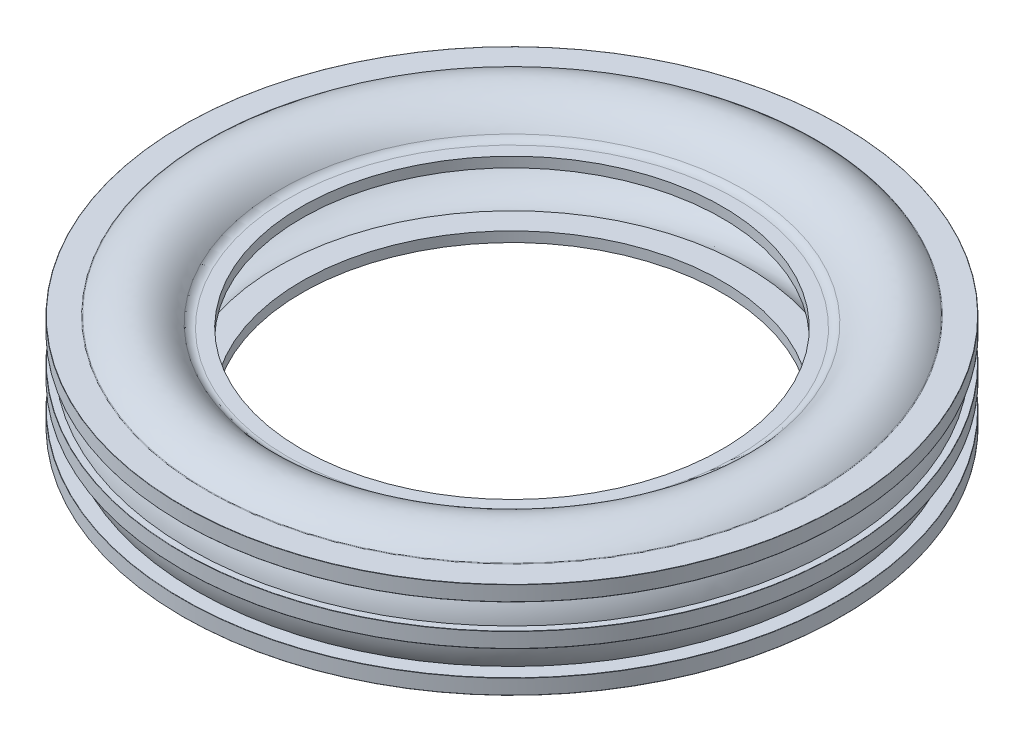
ISO-10303-21;
HEADER;
FILE_DESCRIPTION(('STEP AP214'),'2;1');
FILE_NAME('part.step','',(''),(''),'','','');
FILE_SCHEMA(('AUTOMOTIVE_DESIGN { 1 0 10303 214 1 1 1 1 }'));
ENDSEC;
DATA;
#1=APPLICATION_CONTEXT('core data for automotive mechanical design processes');
#2=APPLICATION_PROTOCOL_DEFINITION('international standard','automotive_design',2000,#1);
#3=PRODUCT_CONTEXT('',#1,'mechanical');
#4=PRODUCT('Part','Part','',(#3));
#5=PRODUCT_RELATED_PRODUCT_CATEGORY('part','',(#4));
#6=PRODUCT_DEFINITION_FORMATION('','',#4);
#7=PRODUCT_DEFINITION_CONTEXT('part definition',#1,'design');
#8=PRODUCT_DEFINITION('design','',#6,#7);
#9=PRODUCT_DEFINITION_SHAPE('','',#8);
#10=(LENGTH_UNIT() NAMED_UNIT(*) SI_UNIT(.MILLI.,.METRE.));
#11=(NAMED_UNIT(*) PLANE_ANGLE_UNIT() SI_UNIT($,.RADIAN.));
#12=(NAMED_UNIT(*) SI_UNIT($,.STERADIAN.) SOLID_ANGLE_UNIT());
#13=UNCERTAINTY_MEASURE_WITH_UNIT(LENGTH_MEASURE(1.E-05),#10,'distance_accuracy_value','');
#14=(GEOMETRIC_REPRESENTATION_CONTEXT(3) GLOBAL_UNCERTAINTY_ASSIGNED_CONTEXT((#13)) GLOBAL_UNIT_ASSIGNED_CONTEXT((#10,
#11,#12)) REPRESENTATION_CONTEXT('',''));
#15=CARTESIAN_POINT('',(0.,0.,0.));
#16=DIRECTION('',(0.,0.,1.));
#17=DIRECTION('',(1.,0.,0.));
#18=AXIS2_PLACEMENT_3D('',#15,#16,#17);
#19=CARTESIAN_POINT('',(-268.,0.,0.));
#20=DIRECTION('',(0.,0.,1.));
#21=DIRECTION('',(0.,1.,0.));
#22=AXIS2_PLACEMENT_3D('',#19,#20,#21);
#23=ELLIPSE('',#22,51.,42.);
#24=CARTESIAN_POINT('',(0.,0.,0.));
#25=DIRECTION('',(0.,1.,0.));
#26=AXIS1_PLACEMENT('',#24,#25);
#27=SURFACE_OF_REVOLUTION('',#23,#26);
#28=CARTESIAN_POINT('',(0.,-7.50000000000003,0.));
#29=DIRECTION('',(0.,1.,0.));
#30=DIRECTION('',(0.,0.,1.));
#31=AXIS2_PLACEMENT_3D('',#28,#29,#30);
#32=CIRCLE('',#31,309.543365427859);
#33=CARTESIAN_POINT('',(0.,-7.50000000000003,309.543365427859));
#34=VERTEX_POINT('',#33);
#35=EDGE_CURVE('E97',#34,#34,#32,.F.);
#36=ORIENTED_EDGE('',*,*,#35,.F.);
#37=EDGE_LOOP('',(#36));
#38=FACE_BOUND('',#37,.T.);
#39=CARTESIAN_POINT('',(0.,-32.5,0.));
#40=DIRECTION('',(0.,1.,0.));
#41=DIRECTION('',(0.,0.,1.));
#42=AXIS2_PLACEMENT_3D('',#39,#40,#41);
#43=CIRCLE('',#42,300.367429910809);
#44=CARTESIAN_POINT('',(0.,-32.5,300.367429910809));
#45=VERTEX_POINT('',#44);
#46=EDGE_CURVE('E91',#45,#45,#43,.T.);
#47=ORIENTED_EDGE('',*,*,#46,.F.);
#48=EDGE_LOOP('',(#47));
#49=FACE_BOUND('',#48,.T.);
#50=ADVANCED_FACE('F32',(#38,#49),#27,.T.);
#51=CARTESIAN_POINT('',(0.,0.,0.));
#52=DIRECTION('',(0.,1.,0.));
#53=AXIS1_PLACEMENT('',#51,#52);
#54=SURFACE_OF_REVOLUTION('',#23,#53);
#55=OFFSET_SURFACE('',#54,-10.,.F.);
#56=CARTESIAN_POINT('',(0.,-7.50000000000004,0.));
#57=DIRECTION('',(0.,1.,0.));
#58=DIRECTION('',(0.,0.,1.));
#59=AXIS2_PLACEMENT_3D('',#56,#57,#58);
#60=CIRCLE('',#59,319.60747870052);
#61=CARTESIAN_POINT('',(0.,-7.50000000000004,319.60747870052));
#62=VERTEX_POINT('',#61);
#63=EDGE_CURVE('E298',#62,#62,#60,.F.);
#64=ORIENTED_EDGE('',*,*,#63,.T.);
#65=EDGE_LOOP('',(#64));
#66=FACE_BOUND('',#65,.T.);
#67=CARTESIAN_POINT('',(0.,-32.5,0.));
#68=DIRECTION('',(0.,1.,0.));
#69=DIRECTION('',(0.,0.,1.));
#70=AXIS2_PLACEMENT_3D('',#67,#68,#69);
#71=CIRCLE('',#70,312.038326603439);
#72=CARTESIAN_POINT('',(0.,-32.5,312.038326603439));
#73=VERTEX_POINT('',#72);
#74=EDGE_CURVE('E92',#73,#73,#71,.T.);
#75=ORIENTED_EDGE('',*,*,#74,.T.);
#76=EDGE_LOOP('',(#75));
#77=FACE_BOUND('',#76,.T.);
#78=ADVANCED_FACE('F216',(#66,#77),#55,.F.);
#79=CARTESIAN_POINT('',(0.,32.5000000000001,0.));
#80=DIRECTION('',(0.,1.,0.));
#81=DIRECTION('',(0.,0.,1.));
#82=AXIS2_PLACEMENT_3D('',#79,#80,#81);
#83=CIRCLE('',#82,312.038326603439);
#84=CARTESIAN_POINT('',(0.,32.5000000000001,312.038326603439));
#85=VERTEX_POINT('',#84);
#86=EDGE_CURVE('E133',#85,#85,#83,.F.);
#87=ORIENTED_EDGE('',*,*,#86,.T.);
#88=EDGE_LOOP('',(#87));
#89=FACE_BOUND('',#88,.T.);
#90=CARTESIAN_POINT('',(0.,7.49999999999996,0.));
#91=DIRECTION('',(0.,1.,0.));
#92=DIRECTION('',(0.,0.,1.));
#93=AXIS2_PLACEMENT_3D('',#90,#91,#92);
#94=CIRCLE('',#93,319.60747870052);
#95=CARTESIAN_POINT('',(0.,7.49999999999996,319.60747870052));
#96=VERTEX_POINT('',#95);
#97=EDGE_CURVE('E301',#96,#96,#94,.T.);
#98=ORIENTED_EDGE('',*,*,#97,.T.);
#99=EDGE_LOOP('',(#98));
#100=FACE_BOUND('',#99,.T.);
#101=ADVANCED_FACE('F221',(#89,#100),#55,.F.);
#102=CARTESIAN_POINT('',(0.,32.5,0.));
#103=DIRECTION('',(0.,1.,0.));
#104=DIRECTION('',(0.,0.,1.));
#105=AXIS2_PLACEMENT_3D('',#102,#103,#104);
#106=CIRCLE('',#105,300.367429910809);
#107=CARTESIAN_POINT('',(0.,32.5,300.367429910809));
#108=VERTEX_POINT('',#107);
#109=EDGE_CURVE('E106',#108,#108,#106,.F.);
#110=ORIENTED_EDGE('',*,*,#109,.F.);
#111=EDGE_LOOP('',(#110));
#112=FACE_BOUND('',#111,.T.);
#113=CARTESIAN_POINT('',(0.,7.49999999999997,0.));
#114=DIRECTION('',(0.,1.,0.));
#115=DIRECTION('',(0.,0.,1.));
#116=AXIS2_PLACEMENT_3D('',#113,#114,#115);
#117=CIRCLE('',#116,309.543365427859);
#118=CARTESIAN_POINT('',(0.,7.49999999999997,309.543365427859));
#119=VERTEX_POINT('',#118);
#120=EDGE_CURVE('E100',#119,#119,#117,.T.);
#121=ORIENTED_EDGE('',*,*,#120,.F.);
#122=EDGE_LOOP('',(#121));
#123=FACE_BOUND('',#122,.T.);
#124=ADVANCED_FACE('F149',(#112,#123),#27,.T.);
#125=CARTESIAN_POINT('',(0.,32.5,300.));
#126=DIRECTION('',(0.,1.,0.));
#127=DIRECTION('',(0.,0.,1.));
#128=AXIS2_PLACEMENT_3D('',#125,#126,#127);
#129=PLANE('',#128);
#130=CARTESIAN_POINT('',(0.,32.5,0.));
#131=DIRECTION('',(0.,-1.,0.));
#132=DIRECTION('',(0.,0.,-1.));
#133=AXIS2_PLACEMENT_3D('',#130,#131,#132);
#134=CIRCLE('',#133,300.);
#135=CARTESIAN_POINT('',(0.,32.5,-300.));
#136=VERTEX_POINT('',#135);
#137=EDGE_CURVE('E295',#136,#136,#134,.T.);
#138=ORIENTED_EDGE('',*,*,#137,.F.);
#139=EDGE_LOOP('',(#138));
#140=FACE_BOUND('',#139,.T.);
#141=ORIENTED_EDGE('',*,*,#109,.T.);
#142=EDGE_LOOP('',(#141));
#143=FACE_BOUND('',#142,.T.);
#144=ADVANCED_FACE('F226',(#140,#143),#129,.F.);
#145=CARTESIAN_POINT('',(0.,0.,0.));
#146=DIRECTION('',(0.,-1.,0.));
#147=DIRECTION('',(0.,0.,-1.));
#148=AXIS2_PLACEMENT_3D('',#145,#146,#147);
#149=CYLINDRICAL_SURFACE('',#148,300.);
#150=ORIENTED_EDGE('',*,*,#137,.T.);
#151=EDGE_LOOP('',(#150));
#152=FACE_BOUND('',#151,.T.);
#153=CARTESIAN_POINT('',(0.,33.0321426640718,0.));
#154=DIRECTION('',(0.,1.,0.));
#155=DIRECTION('',(0.,0.,1.));
#156=AXIS2_PLACEMENT_3D('',#153,#154,#155);
#157=CIRCLE('',#156,300.);
#158=CARTESIAN_POINT('',(0.,33.0321426640718,300.));
#159=VERTEX_POINT('',#158);
#160=EDGE_CURVE('E103',#159,#159,#157,.T.);
#161=ORIENTED_EDGE('',*,*,#160,.T.);
#162=EDGE_LOOP('',(#161));
#163=FACE_BOUND('',#162,.T.);
#164=ADVANCED_FACE('F169',(#152,#163),#149,.F.);
#165=CARTESIAN_POINT('',(0.,27.,0.));
#166=DIRECTION('',(0.,1.,0.));
#167=DIRECTION('',(0.,0.,1.));
#168=AXIS2_PLACEMENT_3D('',#165,#166,#167);
#169=CYLINDRICAL_SURFACE('',#168,208.);
#170=CARTESIAN_POINT('',(0.,37.,0.));
#171=DIRECTION('',(0.,1.,0.));
#172=DIRECTION('',(0.,0.,1.));
#173=AXIS2_PLACEMENT_3D('',#170,#171,#172);
#174=CIRCLE('',#173,208.);
#175=CARTESIAN_POINT('',(0.,37.,208.));
#176=VERTEX_POINT('',#175);
#177=EDGE_CURVE('E121',#176,#176,#174,.T.);
#178=ORIENTED_EDGE('',*,*,#177,.T.);
#179=EDGE_LOOP('',(#178));
#180=FACE_BOUND('',#179,.T.);
#181=CARTESIAN_POINT('',(0.,27.,0.));
#182=DIRECTION('',(0.,1.,0.));
#183=DIRECTION('',(0.,0.,1.));
#184=AXIS2_PLACEMENT_3D('',#181,#182,#183);
#185=CIRCLE('',#184,208.);
#186=CARTESIAN_POINT('',(0.,27.,208.));
#187=VERTEX_POINT('',#186);
#188=EDGE_CURVE('E125',#187,#187,#185,.T.);
#189=ORIENTED_EDGE('',*,*,#188,.F.);
#190=EDGE_LOOP('',(#189));
#191=FACE_BOUND('',#190,.T.);
#192=ADVANCED_FACE('F165',(#180,#191),#169,.F.);
#193=CARTESIAN_POINT('',(-232.368669748356,27.,0.));
#194=DIRECTION('',(0.,1.,0.));
#195=DIRECTION('',(0.,0.,1.));
#196=AXIS2_PLACEMENT_3D('',#193,#194,#195);
#197=PLANE('',#196);
#198=CARTESIAN_POINT('',(0.,27.,0.));
#199=DIRECTION('',(0.,1.,0.));
#200=DIRECTION('',(0.,0.,1.));
#201=AXIS2_PLACEMENT_3D('',#198,#199,#200);
#202=CIRCLE('',#201,232.368669748356);
#203=CARTESIAN_POINT('',(0.,27.,232.368669748356));
#204=VERTEX_POINT('',#203);
#205=EDGE_CURVE('E122',#204,#204,#202,.T.);
#206=ORIENTED_EDGE('',*,*,#205,.F.);
#207=EDGE_LOOP('',(#206));
#208=FACE_BOUND('',#207,.T.);
#209=ORIENTED_EDGE('',*,*,#188,.T.);
#210=EDGE_LOOP('',(#209));
#211=FACE_BOUND('',#210,.T.);
#212=ADVANCED_FACE('F146',(#208,#211),#197,.F.);
#213=ORIENTED_EDGE('',*,*,#205,.T.);
#214=EDGE_LOOP('',(#213));
#215=FACE_BOUND('',#214,.T.);
#216=ORIENTED_EDGE('',*,*,#160,.F.);
#217=EDGE_LOOP('',(#216));
#218=FACE_BOUND('',#217,.T.);
#219=ADVANCED_FACE('F140',(#215,#218),#27,.T.);
#220=CARTESIAN_POINT('',(-232.368669748356,37.,0.));
#221=DIRECTION('',(0.,1.,0.));
#222=DIRECTION('',(0.,0.,1.));
#223=AXIS2_PLACEMENT_3D('',#220,#221,#222);
#224=PLANE('',#223);
#225=CARTESIAN_POINT('',(0.,37.,0.));
#226=DIRECTION('',(0.,1.,0.));
#227=DIRECTION('',(0.,0.,1.));
#228=AXIS2_PLACEMENT_3D('',#225,#226,#227);
#229=CIRCLE('',#228,221.449006055394);
#230=CARTESIAN_POINT('',(0.,37.,221.449006055394));
#231=VERTEX_POINT('',#230);
#232=EDGE_CURVE('E109',#231,#231,#229,.T.);
#233=ORIENTED_EDGE('',*,*,#232,.T.);
#234=EDGE_LOOP('',(#233));
#235=FACE_BOUND('',#234,.T.);
#236=ORIENTED_EDGE('',*,*,#177,.F.);
#237=EDGE_LOOP('',(#236));
#238=FACE_BOUND('',#237,.T.);
#239=ADVANCED_FACE('F145',(#235,#238),#224,.T.);
#240=CARTESIAN_POINT('',(0.,46.9999999999999,0.));
#241=DIRECTION('',(0.,1.,0.));
#242=DIRECTION('',(0.,0.,1.));
#243=AXIS2_PLACEMENT_3D('',#240,#241,#242);
#244=TOROIDAL_SURFACE('',#243,221.449006055394,10.);
#245=CARTESIAN_POINT('',(0.,40.9039189503142,0.));
#246=DIRECTION('',(0.,1.,0.));
#247=DIRECTION('',(0.,0.,1.));
#248=AXIS2_PLACEMENT_3D('',#245,#246,#247);
#249=CIRCLE('',#248,229.376035501263);
#250=CARTESIAN_POINT('',(0.,40.9039189503142,229.376035501263));
#251=VERTEX_POINT('',#250);
#252=EDGE_CURVE('E118',#251,#251,#249,.F.);
#253=ORIENTED_EDGE('',*,*,#252,.F.);
#254=EDGE_LOOP('',(#253));
#255=FACE_BOUND('',#254,.T.);
#256=ORIENTED_EDGE('',*,*,#232,.F.);
#257=EDGE_LOOP('',(#256));
#258=FACE_BOUND('',#257,.T.);
#259=ADVANCED_FACE('F177',(#255,#258),#244,.F.);
#260=CARTESIAN_POINT('',(0.,47.7685313795157,0.));
#261=DIRECTION('',(0.,1.,0.));
#262=DIRECTION('',(0.,0.,1.));
#263=AXIS2_PLACEMENT_3D('',#260,#261,#262);
#264=CIRCLE('',#263,300.394429937037);
#265=CARTESIAN_POINT('',(0.,47.7685313795157,300.394429937037));
#266=VERTEX_POINT('',#265);
#267=EDGE_CURVE('E47',#266,#266,#264,.T.);
#268=ORIENTED_EDGE('',*,*,#267,.T.);
#269=EDGE_LOOP('',(#268));
#270=FACE_BOUND('',#269,.T.);
#271=ORIENTED_EDGE('',*,*,#252,.T.);
#272=EDGE_LOOP('',(#271));
#273=FACE_BOUND('',#272,.T.);
#274=ADVANCED_FACE('F180',(#270,#273),#55,.F.);
#275=CARTESIAN_POINT('',(0.,32.5,0.));
#276=DIRECTION('',(0.,1.,0.));
#277=DIRECTION('',(0.,0.,1.));
#278=AXIS2_PLACEMENT_3D('',#275,#276,#277);
#279=CIRCLE('',#278,325.75);
#280=CARTESIAN_POINT('',(0.,32.5,325.75));
#281=VERTEX_POINT('',#280);
#282=EDGE_CURVE('E76',#281,#281,#279,.F.);
#283=ORIENTED_EDGE('',*,*,#282,.T.);
#284=EDGE_LOOP('',(#283));
#285=FACE_BOUND('',#284,.T.);
#286=ORIENTED_EDGE('',*,*,#86,.F.);
#287=EDGE_LOOP('',(#286));
#288=FACE_BOUND('',#287,.T.);
#289=ADVANCED_FACE('F276',(#285,#288),#129,.F.);
#290=CARTESIAN_POINT('',(0.,0.,0.));
#291=DIRECTION('',(0.,-1.,0.));
#292=DIRECTION('',(0.,0.,-1.));
#293=AXIS2_PLACEMENT_3D('',#290,#291,#292);
#294=CYLINDRICAL_SURFACE('',#293,326.);
#295=CARTESIAN_POINT('',(0.,47.25,0.));
#296=DIRECTION('',(0.,-1.,0.));
#297=DIRECTION('',(0.,0.,-1.));
#298=AXIS2_PLACEMENT_3D('',#295,#296,#297);
#299=CIRCLE('',#298,326.);
#300=CARTESIAN_POINT('',(0.,47.25,-326.));
#301=VERTEX_POINT('',#300);
#302=EDGE_CURVE('E82',#301,#301,#299,.T.);
#303=ORIENTED_EDGE('',*,*,#302,.T.);
#304=EDGE_LOOP('',(#303));
#305=FACE_BOUND('',#304,.T.);
#306=CARTESIAN_POINT('',(0.,32.75,0.));
#307=DIRECTION('',(0.,1.,0.));
#308=DIRECTION('',(0.,0.,1.));
#309=AXIS2_PLACEMENT_3D('',#306,#307,#308);
#310=CIRCLE('',#309,326.);
#311=CARTESIAN_POINT('',(0.,32.75,326.));
#312=VERTEX_POINT('',#311);
#313=EDGE_CURVE('E85',#312,#312,#310,.T.);
#314=ORIENTED_EDGE('',*,*,#313,.T.);
#315=EDGE_LOOP('',(#314));
#316=FACE_BOUND('',#315,.T.);
#317=ADVANCED_FACE('F272',(#305,#316),#294,.T.);
#318=CARTESIAN_POINT('',(0.,47.5,300.));
#319=DIRECTION('',(0.,-1.,0.));
#320=DIRECTION('',(0.,0.,-1.));
#321=AXIS2_PLACEMENT_3D('',#318,#319,#320);
#322=PLANE('',#321);
#323=CARTESIAN_POINT('',(0.,47.5,0.));
#324=DIRECTION('',(0.,-1.,0.));
#325=DIRECTION('',(0.,0.,-1.));
#326=AXIS2_PLACEMENT_3D('',#323,#324,#325);
#327=CIRCLE('',#326,301.076305040885);
#328=CARTESIAN_POINT('',(0.,47.5,-301.076305040885));
#329=VERTEX_POINT('',#328);
#330=EDGE_CURVE('E43',#329,#329,#327,.T.);
#331=ORIENTED_EDGE('',*,*,#330,.T.);
#332=EDGE_LOOP('',(#331));
#333=FACE_BOUND('',#332,.T.);
#334=CARTESIAN_POINT('',(0.,47.5,0.));
#335=DIRECTION('',(0.,-1.,0.));
#336=DIRECTION('',(0.,0.,-1.));
#337=AXIS2_PLACEMENT_3D('',#334,#335,#336);
#338=CIRCLE('',#337,325.75);
#339=CARTESIAN_POINT('',(0.,47.5,-325.75));
#340=VERTEX_POINT('',#339);
#341=EDGE_CURVE('E79',#340,#340,#338,.F.);
#342=ORIENTED_EDGE('',*,*,#341,.T.);
#343=EDGE_LOOP('',(#342));
#344=FACE_BOUND('',#343,.T.);
#345=ADVANCED_FACE('F269',(#333,#344),#322,.F.);
#346=CARTESIAN_POINT('',(0.,-7.50000000000003,300.));
#347=DIRECTION('',(0.,1.,0.));
#348=DIRECTION('',(0.,0.,1.));
#349=AXIS2_PLACEMENT_3D('',#346,#347,#348);
#350=PLANE('',#349);
#351=CARTESIAN_POINT('',(0.,-7.50000000000003,0.));
#352=DIRECTION('',(0.,-1.,0.));
#353=DIRECTION('',(0.,0.,-1.));
#354=AXIS2_PLACEMENT_3D('',#351,#352,#353);
#355=CIRCLE('',#354,300.);
#356=CARTESIAN_POINT('',(0.,-7.50000000000003,-300.));
#357=VERTEX_POINT('',#356);
#358=EDGE_CURVE('E304',#357,#357,#355,.T.);
#359=ORIENTED_EDGE('',*,*,#358,.F.);
#360=EDGE_LOOP('',(#359));
#361=FACE_BOUND('',#360,.T.);
#362=ORIENTED_EDGE('',*,*,#35,.T.);
#363=EDGE_LOOP('',(#362));
#364=FACE_BOUND('',#363,.T.);
#365=ADVANCED_FACE('F264',(#361,#364),#350,.F.);
#366=CARTESIAN_POINT('',(0.,0.,0.));
#367=DIRECTION('',(0.,-1.,0.));
#368=DIRECTION('',(0.,0.,-1.));
#369=AXIS2_PLACEMENT_3D('',#366,#367,#368);
#370=CYLINDRICAL_SURFACE('',#369,300.);
#371=CARTESIAN_POINT('',(0.,7.49999999999997,0.));
#372=DIRECTION('',(0.,-1.,0.));
#373=DIRECTION('',(0.,0.,-1.));
#374=AXIS2_PLACEMENT_3D('',#371,#372,#373);
#375=CIRCLE('',#374,300.);
#376=CARTESIAN_POINT('',(0.,7.49999999999997,-300.));
#377=VERTEX_POINT('',#376);
#378=EDGE_CURVE('E95',#377,#377,#375,.T.);
#379=ORIENTED_EDGE('',*,*,#378,.F.);
#380=EDGE_LOOP('',(#379));
#381=FACE_BOUND('',#380,.T.);
#382=ORIENTED_EDGE('',*,*,#358,.T.);
#383=EDGE_LOOP('',(#382));
#384=FACE_BOUND('',#383,.T.);
#385=ADVANCED_FACE('F265',(#381,#384),#370,.F.);
#386=CARTESIAN_POINT('',(0.,7.49999999999997,300.));
#387=DIRECTION('',(0.,-1.,0.));
#388=DIRECTION('',(0.,0.,-1.));
#389=AXIS2_PLACEMENT_3D('',#386,#387,#388);
#390=PLANE('',#389);
#391=ORIENTED_EDGE('',*,*,#378,.T.);
#392=EDGE_LOOP('',(#391));
#393=FACE_BOUND('',#392,.T.);
#394=ORIENTED_EDGE('',*,*,#120,.T.);
#395=EDGE_LOOP('',(#394));
#396=FACE_BOUND('',#395,.T.);
#397=ADVANCED_FACE('F256',(#393,#396),#390,.F.);
#398=CARTESIAN_POINT('',(0.,-7.50000000000003,0.));
#399=DIRECTION('',(0.,1.,0.));
#400=DIRECTION('',(0.,0.,1.));
#401=AXIS2_PLACEMENT_3D('',#398,#399,#400);
#402=CIRCLE('',#401,325.75);
#403=CARTESIAN_POINT('',(0.,-7.50000000000003,325.75));
#404=VERTEX_POINT('',#403);
#405=EDGE_CURVE('E64',#404,#404,#402,.F.);
#406=ORIENTED_EDGE('',*,*,#405,.T.);
#407=EDGE_LOOP('',(#406));
#408=FACE_BOUND('',#407,.T.);
#409=ORIENTED_EDGE('',*,*,#63,.F.);
#410=EDGE_LOOP('',(#409));
#411=FACE_BOUND('',#410,.T.);
#412=ADVANCED_FACE('F259',(#408,#411),#350,.F.);
#413=CARTESIAN_POINT('',(0.,0.,0.));
#414=DIRECTION('',(0.,-1.,0.));
#415=DIRECTION('',(0.,0.,-1.));
#416=AXIS2_PLACEMENT_3D('',#413,#414,#415);
#417=CYLINDRICAL_SURFACE('',#416,326.);
#418=CARTESIAN_POINT('',(0.,7.24999999999996,0.));
#419=DIRECTION('',(0.,-1.,0.));
#420=DIRECTION('',(0.,0.,-1.));
#421=AXIS2_PLACEMENT_3D('',#418,#419,#420);
#422=CIRCLE('',#421,326.);
#423=CARTESIAN_POINT('',(0.,7.24999999999996,-326.));
#424=VERTEX_POINT('',#423);
#425=EDGE_CURVE('E70',#424,#424,#422,.T.);
#426=ORIENTED_EDGE('',*,*,#425,.T.);
#427=EDGE_LOOP('',(#426));
#428=FACE_BOUND('',#427,.T.);
#429=CARTESIAN_POINT('',(0.,-7.25000000000003,0.));
#430=DIRECTION('',(0.,1.,0.));
#431=DIRECTION('',(0.,0.,1.));
#432=AXIS2_PLACEMENT_3D('',#429,#430,#431);
#433=CIRCLE('',#432,326.);
#434=CARTESIAN_POINT('',(0.,-7.25000000000003,326.));
#435=VERTEX_POINT('',#434);
#436=EDGE_CURVE('E73',#435,#435,#433,.T.);
#437=ORIENTED_EDGE('',*,*,#436,.T.);
#438=EDGE_LOOP('',(#437));
#439=FACE_BOUND('',#438,.T.);
#440=ADVANCED_FACE('F254',(#428,#439),#417,.T.);
#441=CARTESIAN_POINT('',(0.,7.49999999999997,0.));
#442=DIRECTION('',(0.,-1.,0.));
#443=DIRECTION('',(0.,0.,-1.));
#444=AXIS2_PLACEMENT_3D('',#441,#442,#443);
#445=CIRCLE('',#444,325.75);
#446=CARTESIAN_POINT('',(0.,7.49999999999997,-325.75));
#447=VERTEX_POINT('',#446);
#448=EDGE_CURVE('E67',#447,#447,#445,.F.);
#449=ORIENTED_EDGE('',*,*,#448,.T.);
#450=EDGE_LOOP('',(#449));
#451=FACE_BOUND('',#450,.T.);
#452=ORIENTED_EDGE('',*,*,#97,.F.);
#453=EDGE_LOOP('',(#452));
#454=FACE_BOUND('',#453,.T.);
#455=ADVANCED_FACE('F251',(#451,#454),#390,.F.);
#456=CARTESIAN_POINT('',(0.,-32.5,299.999999999999));
#457=DIRECTION('',(0.,-1.,0.));
#458=DIRECTION('',(0.,0.,-1.));
#459=AXIS2_PLACEMENT_3D('',#456,#457,#458);
#460=PLANE('',#459);
#461=CARTESIAN_POINT('',(0.,-32.5,0.));
#462=DIRECTION('',(0.,-1.,0.));
#463=DIRECTION('',(0.,0.,-1.));
#464=AXIS2_PLACEMENT_3D('',#461,#462,#463);
#465=CIRCLE('',#464,325.749999999999);
#466=CARTESIAN_POINT('',(0.,-32.5,-325.749999999999));
#467=VERTEX_POINT('',#466);
#468=EDGE_CURVE('E55',#467,#467,#465,.F.);
#469=ORIENTED_EDGE('',*,*,#468,.T.);
#470=EDGE_LOOP('',(#469));
#471=FACE_BOUND('',#470,.T.);
#472=ORIENTED_EDGE('',*,*,#74,.F.);
#473=EDGE_LOOP('',(#472));
#474=FACE_BOUND('',#473,.T.);
#475=ADVANCED_FACE('F246',(#471,#474),#460,.F.);
#476=CARTESIAN_POINT('',(0.,0.,0.));
#477=DIRECTION('',(0.,-1.,0.));
#478=DIRECTION('',(0.,0.,-1.));
#479=AXIS2_PLACEMENT_3D('',#476,#477,#478);
#480=CYLINDRICAL_SURFACE('',#479,325.999999999999);
#481=CARTESIAN_POINT('',(0.,-32.75,0.));
#482=DIRECTION('',(0.,-1.,0.));
#483=DIRECTION('',(0.,0.,-1.));
#484=AXIS2_PLACEMENT_3D('',#481,#482,#483);
#485=CIRCLE('',#484,325.999999999999);
#486=CARTESIAN_POINT('',(0.,-32.75,-325.999999999999));
#487=VERTEX_POINT('',#486);
#488=EDGE_CURVE('E58',#487,#487,#485,.T.);
#489=ORIENTED_EDGE('',*,*,#488,.T.);
#490=EDGE_LOOP('',(#489));
#491=FACE_BOUND('',#490,.T.);
#492=CARTESIAN_POINT('',(0.,-47.25,0.));
#493=DIRECTION('',(0.,1.,0.));
#494=DIRECTION('',(0.,0.,1.));
#495=AXIS2_PLACEMENT_3D('',#492,#493,#494);
#496=CIRCLE('',#495,325.999999999999);
#497=CARTESIAN_POINT('',(0.,-47.25,325.999999999999));
#498=VERTEX_POINT('',#497);
#499=EDGE_CURVE('E61',#498,#498,#496,.T.);
#500=ORIENTED_EDGE('',*,*,#499,.T.);
#501=EDGE_LOOP('',(#500));
#502=FACE_BOUND('',#501,.T.);
#503=ADVANCED_FACE('F355',(#491,#502),#480,.T.);
#504=CARTESIAN_POINT('',(0.,-47.5,299.999999999999));
#505=DIRECTION('',(0.,1.,0.));
#506=DIRECTION('',(0.,0.,1.));
#507=AXIS2_PLACEMENT_3D('',#504,#505,#506);
#508=PLANE('',#507);
#509=CARTESIAN_POINT('',(0.,-47.5,0.));
#510=DIRECTION('',(0.,1.,0.));
#511=DIRECTION('',(0.,0.,1.));
#512=AXIS2_PLACEMENT_3D('',#509,#510,#511);
#513=CIRCLE('',#512,301.076305040884);
#514=CARTESIAN_POINT('',(0.,-47.5,301.076305040884));
#515=VERTEX_POINT('',#514);
#516=EDGE_CURVE('E10',#515,#515,#513,.T.);
#517=ORIENTED_EDGE('',*,*,#516,.T.);
#518=EDGE_LOOP('',(#517));
#519=FACE_BOUND('',#518,.T.);
#520=CARTESIAN_POINT('',(0.,-47.5,0.));
#521=DIRECTION('',(0.,1.,0.));
#522=DIRECTION('',(0.,0.,1.));
#523=AXIS2_PLACEMENT_3D('',#520,#521,#522);
#524=CIRCLE('',#523,325.749999999999);
#525=CARTESIAN_POINT('',(0.,-47.5,325.749999999999));
#526=VERTEX_POINT('',#525);
#527=EDGE_CURVE('E52',#526,#526,#524,.F.);
#528=ORIENTED_EDGE('',*,*,#527,.T.);
#529=EDGE_LOOP('',(#528));
#530=FACE_BOUND('',#529,.T.);
#531=ADVANCED_FACE('F156',(#519,#530),#508,.F.);
#532=CARTESIAN_POINT('',(-232.368669748356,-37.,0.));
#533=DIRECTION('',(0.,-1.,0.));
#534=DIRECTION('',(0.,0.,-1.));
#535=AXIS2_PLACEMENT_3D('',#532,#533,#534);
#536=PLANE('',#535);
#537=CARTESIAN_POINT('',(0.,-37.,0.));
#538=DIRECTION('',(0.,-1.,0.));
#539=DIRECTION('',(0.,0.,-1.));
#540=AXIS2_PLACEMENT_3D('',#537,#538,#539);
#541=CIRCLE('',#540,221.449006055394);
#542=CARTESIAN_POINT('',(0.,-37.,-221.449006055394));
#543=VERTEX_POINT('',#542);
#544=EDGE_CURVE('E112',#543,#543,#541,.T.);
#545=ORIENTED_EDGE('',*,*,#544,.T.);
#546=EDGE_LOOP('',(#545));
#547=FACE_BOUND('',#546,.T.);
#548=CARTESIAN_POINT('',(0.,-37.,0.));
#549=DIRECTION('',(0.,1.,0.));
#550=DIRECTION('',(0.,0.,1.));
#551=AXIS2_PLACEMENT_3D('',#548,#549,#550);
#552=CIRCLE('',#551,208.);
#553=CARTESIAN_POINT('',(0.,-37.,208.));
#554=VERTEX_POINT('',#553);
#555=EDGE_CURVE('E129',#554,#554,#552,.T.);
#556=ORIENTED_EDGE('',*,*,#555,.T.);
#557=EDGE_LOOP('',(#556));
#558=FACE_BOUND('',#557,.T.);
#559=ADVANCED_FACE('F152',(#547,#558),#536,.T.);
#560=CARTESIAN_POINT('',(0.,-47.,0.));
#561=DIRECTION('',(0.,1.,0.));
#562=DIRECTION('',(0.,0.,1.));
#563=AXIS2_PLACEMENT_3D('',#560,#561,#562);
#564=TOROIDAL_SURFACE('',#563,221.449006055394,10.);
#565=ORIENTED_EDGE('',*,*,#544,.F.);
#566=EDGE_LOOP('',(#565));
#567=FACE_BOUND('',#566,.T.);
#568=CARTESIAN_POINT('',(0.,-40.9039189503143,0.));
#569=DIRECTION('',(0.,1.,0.));
#570=DIRECTION('',(0.,0.,1.));
#571=AXIS2_PLACEMENT_3D('',#568,#569,#570);
#572=CIRCLE('',#571,229.376035501263);
#573=CARTESIAN_POINT('',(0.,-40.9039189503143,229.376035501263));
#574=VERTEX_POINT('',#573);
#575=EDGE_CURVE('E115',#574,#574,#572,.T.);
#576=ORIENTED_EDGE('',*,*,#575,.F.);
#577=EDGE_LOOP('',(#576));
#578=FACE_BOUND('',#577,.T.);
#579=ADVANCED_FACE('F155',(#567,#578),#564,.F.);
#580=CARTESIAN_POINT('',(0.,-47.7685313795158,0.));
#581=DIRECTION('',(0.,1.,0.));
#582=DIRECTION('',(0.,0.,1.));
#583=AXIS2_PLACEMENT_3D('',#580,#581,#582);
#584=CIRCLE('',#583,300.394429937037);
#585=CARTESIAN_POINT('',(0.,-47.7685313795158,300.394429937037));
#586=VERTEX_POINT('',#585);
#587=EDGE_CURVE('E39',#586,#586,#584,.F.);
#588=ORIENTED_EDGE('',*,*,#587,.T.);
#589=EDGE_LOOP('',(#588));
#590=FACE_BOUND('',#589,.T.);
#591=ORIENTED_EDGE('',*,*,#575,.T.);
#592=EDGE_LOOP('',(#591));
#593=FACE_BOUND('',#592,.T.);
#594=ADVANCED_FACE('F150',(#590,#593),#55,.F.);
#595=CARTESIAN_POINT('',(0.,-27.,0.));
#596=DIRECTION('',(0.,-1.,0.));
#597=DIRECTION('',(0.,0.,-1.));
#598=AXIS2_PLACEMENT_3D('',#595,#596,#597);
#599=CYLINDRICAL_SURFACE('',#598,208.);
#600=ORIENTED_EDGE('',*,*,#555,.F.);
#601=EDGE_LOOP('',(#600));
#602=FACE_BOUND('',#601,.T.);
#603=CARTESIAN_POINT('',(0.,-27.,0.));
#604=DIRECTION('',(0.,1.,0.));
#605=DIRECTION('',(0.,0.,1.));
#606=AXIS2_PLACEMENT_3D('',#603,#604,#605);
#607=CIRCLE('',#606,208.);
#608=CARTESIAN_POINT('',(0.,-27.,208.));
#609=VERTEX_POINT('',#608);
#610=EDGE_CURVE('E126',#609,#609,#607,.T.);
#611=ORIENTED_EDGE('',*,*,#610,.T.);
#612=EDGE_LOOP('',(#611));
#613=FACE_BOUND('',#612,.T.);
#614=ADVANCED_FACE('F161',(#602,#613),#599,.F.);
#615=CARTESIAN_POINT('',(-232.368669748356,-27.,0.));
#616=DIRECTION('',(0.,-1.,0.));
#617=DIRECTION('',(0.,0.,-1.));
#618=AXIS2_PLACEMENT_3D('',#615,#616,#617);
#619=PLANE('',#618);
#620=ORIENTED_EDGE('',*,*,#610,.F.);
#621=EDGE_LOOP('',(#620));
#622=FACE_BOUND('',#621,.T.);
#623=CARTESIAN_POINT('',(0.,-27.,0.));
#624=DIRECTION('',(0.,1.,0.));
#625=DIRECTION('',(0.,0.,1.));
#626=AXIS2_PLACEMENT_3D('',#623,#624,#625);
#627=CIRCLE('',#626,232.368669748356);
#628=CARTESIAN_POINT('',(0.,-27.,232.368669748356));
#629=VERTEX_POINT('',#628);
#630=EDGE_CURVE('E130',#629,#629,#627,.T.);
#631=ORIENTED_EDGE('',*,*,#630,.T.);
#632=EDGE_LOOP('',(#631));
#633=FACE_BOUND('',#632,.T.);
#634=ADVANCED_FACE('F158',(#622,#633),#619,.F.);
#635=ORIENTED_EDGE('',*,*,#630,.F.);
#636=EDGE_LOOP('',(#635));
#637=FACE_BOUND('',#636,.T.);
#638=CARTESIAN_POINT('',(0.,-33.032142664073,0.));
#639=DIRECTION('',(0.,1.,0.));
#640=DIRECTION('',(0.,0.,1.));
#641=AXIS2_PLACEMENT_3D('',#638,#639,#640);
#642=CIRCLE('',#641,299.999999999999);
#643=CARTESIAN_POINT('',(0.,-33.032142664073,299.999999999999));
#644=VERTEX_POINT('',#643);
#645=EDGE_CURVE('E88',#644,#644,#642,.F.);
#646=ORIENTED_EDGE('',*,*,#645,.F.);
#647=EDGE_LOOP('',(#646));
#648=FACE_BOUND('',#647,.T.);
#649=ADVANCED_FACE('F148',(#637,#648),#27,.T.);
#650=CARTESIAN_POINT('',(0.,0.,0.));
#651=DIRECTION('',(0.,-1.,0.));
#652=DIRECTION('',(0.,0.,-1.));
#653=AXIS2_PLACEMENT_3D('',#650,#651,#652);
#654=CYLINDRICAL_SURFACE('',#653,299.999999999999);
#655=CARTESIAN_POINT('',(0.,-32.5,0.));
#656=DIRECTION('',(0.,-1.,0.));
#657=DIRECTION('',(0.,0.,-1.));
#658=AXIS2_PLACEMENT_3D('',#655,#656,#657);
#659=CIRCLE('',#658,299.999999999999);
#660=CARTESIAN_POINT('',(0.,-32.5,-299.999999999999));
#661=VERTEX_POINT('',#660);
#662=EDGE_CURVE('E96',#661,#661,#659,.T.);
#663=ORIENTED_EDGE('',*,*,#662,.F.);
#664=EDGE_LOOP('',(#663));
#665=FACE_BOUND('',#664,.T.);
#666=ORIENTED_EDGE('',*,*,#645,.T.);
#667=EDGE_LOOP('',(#666));
#668=FACE_BOUND('',#667,.T.);
#669=ADVANCED_FACE('F229',(#665,#668),#654,.F.);
#670=ORIENTED_EDGE('',*,*,#662,.T.);
#671=EDGE_LOOP('',(#670));
#672=FACE_BOUND('',#671,.T.);
#673=ORIENTED_EDGE('',*,*,#46,.T.);
#674=EDGE_LOOP('',(#673));
#675=FACE_BOUND('',#674,.T.);
#676=ADVANCED_FACE('F186',(#672,#675),#460,.F.);
#677=CARTESIAN_POINT('',(0.,47.25,0.));
#678=DIRECTION('',(0.,-1.,0.));
#679=DIRECTION('',(0.,0.,-1.));
#680=AXIS2_PLACEMENT_3D('',#677,#678,#679);
#681=TOROIDAL_SURFACE('',#680,325.75,0.25);
#682=ORIENTED_EDGE('',*,*,#341,.F.);
#683=EDGE_LOOP('',(#682));
#684=FACE_BOUND('',#683,.T.);
#685=ORIENTED_EDGE('',*,*,#302,.F.);
#686=EDGE_LOOP('',(#685));
#687=FACE_BOUND('',#686,.T.);
#688=ADVANCED_FACE('F182',(#684,#687),#681,.T.);
#689=CARTESIAN_POINT('',(0.,32.75,0.));
#690=DIRECTION('',(0.,1.,0.));
#691=DIRECTION('',(0.,0.,1.));
#692=AXIS2_PLACEMENT_3D('',#689,#690,#691);
#693=TOROIDAL_SURFACE('',#692,325.75,0.25);
#694=ORIENTED_EDGE('',*,*,#313,.F.);
#695=EDGE_LOOP('',(#694));
#696=FACE_BOUND('',#695,.T.);
#697=ORIENTED_EDGE('',*,*,#282,.F.);
#698=EDGE_LOOP('',(#697));
#699=FACE_BOUND('',#698,.T.);
#700=ADVANCED_FACE('F185',(#696,#699),#693,.T.);
#701=CARTESIAN_POINT('',(0.,7.24999999999996,0.));
#702=DIRECTION('',(0.,-1.,0.));
#703=DIRECTION('',(0.,0.,-1.));
#704=AXIS2_PLACEMENT_3D('',#701,#702,#703);
#705=TOROIDAL_SURFACE('',#704,325.75,0.25);
#706=ORIENTED_EDGE('',*,*,#448,.F.);
#707=EDGE_LOOP('',(#706));
#708=FACE_BOUND('',#707,.T.);
#709=ORIENTED_EDGE('',*,*,#425,.F.);
#710=EDGE_LOOP('',(#709));
#711=FACE_BOUND('',#710,.T.);
#712=ADVANCED_FACE('F190',(#708,#711),#705,.T.);
#713=CARTESIAN_POINT('',(0.,-7.25000000000003,0.));
#714=DIRECTION('',(0.,1.,0.));
#715=DIRECTION('',(0.,0.,1.));
#716=AXIS2_PLACEMENT_3D('',#713,#714,#715);
#717=TOROIDAL_SURFACE('',#716,325.75,0.25);
#718=ORIENTED_EDGE('',*,*,#436,.F.);
#719=EDGE_LOOP('',(#718));
#720=FACE_BOUND('',#719,.T.);
#721=ORIENTED_EDGE('',*,*,#405,.F.);
#722=EDGE_LOOP('',(#721));
#723=FACE_BOUND('',#722,.T.);
#724=ADVANCED_FACE('F194',(#720,#723),#717,.T.);
#725=CARTESIAN_POINT('',(0.,-32.75,0.));
#726=DIRECTION('',(0.,-1.,0.));
#727=DIRECTION('',(0.,0.,-1.));
#728=AXIS2_PLACEMENT_3D('',#725,#726,#727);
#729=TOROIDAL_SURFACE('',#728,325.749999999999,0.25);
#730=ORIENTED_EDGE('',*,*,#468,.F.);
#731=EDGE_LOOP('',(#730));
#732=FACE_BOUND('',#731,.T.);
#733=ORIENTED_EDGE('',*,*,#488,.F.);
#734=EDGE_LOOP('',(#733));
#735=FACE_BOUND('',#734,.T.);
#736=ADVANCED_FACE('F198',(#732,#735),#729,.T.);
#737=CARTESIAN_POINT('',(0.,-47.25,0.));
#738=DIRECTION('',(0.,1.,0.));
#739=DIRECTION('',(0.,0.,1.));
#740=AXIS2_PLACEMENT_3D('',#737,#738,#739);
#741=TOROIDAL_SURFACE('',#740,325.749999999999,0.25);
#742=ORIENTED_EDGE('',*,*,#499,.F.);
#743=EDGE_LOOP('',(#742));
#744=FACE_BOUND('',#743,.T.);
#745=ORIENTED_EDGE('',*,*,#527,.F.);
#746=EDGE_LOOP('',(#745));
#747=FACE_BOUND('',#746,.T.);
#748=ADVANCED_FACE('F202',(#744,#747),#741,.T.);
#749=CARTESIAN_POINT('',(0.,48.5,0.));
#750=DIRECTION('',(0.,1.,0.));
#751=DIRECTION('',(0.,0.,1.));
#752=AXIS2_PLACEMENT_3D('',#749,#750,#751);
#753=TOROIDAL_SURFACE('',#752,301.076305040885,1.);
#754=ORIENTED_EDGE('',*,*,#330,.F.);
#755=EDGE_LOOP('',(#754));
#756=FACE_BOUND('',#755,.T.);
#757=ORIENTED_EDGE('',*,*,#267,.F.);
#758=EDGE_LOOP('',(#757));
#759=FACE_BOUND('',#758,.T.);
#760=ADVANCED_FACE('F205',(#756,#759),#753,.F.);
#761=CARTESIAN_POINT('',(0.,-48.5,0.));
#762=DIRECTION('',(0.,1.,0.));
#763=DIRECTION('',(0.,0.,1.));
#764=AXIS2_PLACEMENT_3D('',#761,#762,#763);
#765=TOROIDAL_SURFACE('',#764,301.076305040884,1.);
#766=ORIENTED_EDGE('',*,*,#516,.F.);
#767=EDGE_LOOP('',(#766));
#768=FACE_BOUND('',#767,.T.);
#769=ORIENTED_EDGE('',*,*,#587,.F.);
#770=EDGE_LOOP('',(#769));
#771=FACE_BOUND('',#770,.T.);
#772=ADVANCED_FACE('F34',(#768,#771),#765,.F.);
#773=CLOSED_SHELL('',(#50,#78,#101,#124,#144,#164,#192,#212,#219,#239,#259,#274,#289,#317,#345,
#365,#385,#397,#412,#440,#455,#475,#503,#531,#559,#579,#594,#614,#634,#649,#669,#676,#688,#700,
#712,#724,#736,#748,#760,#772));
#774=MANIFOLD_SOLID_BREP('B2',#773);
#775=ADVANCED_BREP_SHAPE_REPRESENTATION('',(#18,#774),#14);
#776=SHAPE_DEFINITION_REPRESENTATION(#9,#775);
ENDSEC;
END-ISO-10303-21;
